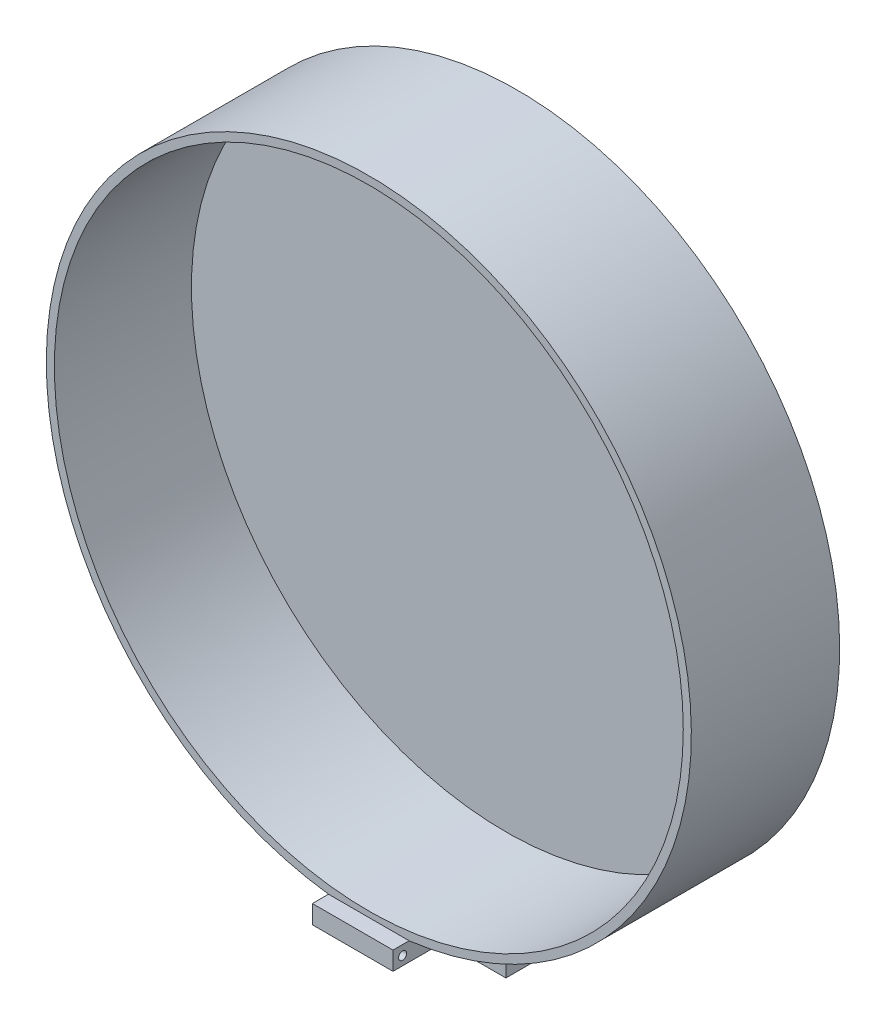
ISO-10303-21;
HEADER;
FILE_DESCRIPTION(('STEP AP214'),'2;1');
FILE_NAME('part.step','',(''),(''),'','','');
FILE_SCHEMA(('AUTOMOTIVE_DESIGN { 1 0 10303 214 1 1 1 1 }'));
ENDSEC;
DATA;
#1=APPLICATION_CONTEXT('core data for automotive mechanical design processes');
#2=APPLICATION_PROTOCOL_DEFINITION('international standard','automotive_design',2000,#1);
#3=PRODUCT_CONTEXT('',#1,'mechanical');
#4=PRODUCT('Part','Part','',(#3));
#5=PRODUCT_RELATED_PRODUCT_CATEGORY('part','',(#4));
#6=PRODUCT_DEFINITION_FORMATION('','',#4);
#7=PRODUCT_DEFINITION_CONTEXT('part definition',#1,'design');
#8=PRODUCT_DEFINITION('design','',#6,#7);
#9=PRODUCT_DEFINITION_SHAPE('','',#8);
#10=(LENGTH_UNIT() NAMED_UNIT(*) SI_UNIT(.MILLI.,.METRE.));
#11=(NAMED_UNIT(*) PLANE_ANGLE_UNIT() SI_UNIT($,.RADIAN.));
#12=(NAMED_UNIT(*) SI_UNIT($,.STERADIAN.) SOLID_ANGLE_UNIT());
#13=UNCERTAINTY_MEASURE_WITH_UNIT(LENGTH_MEASURE(1.E-05),#10,'distance_accuracy_value','');
#14=(GEOMETRIC_REPRESENTATION_CONTEXT(3) GLOBAL_UNCERTAINTY_ASSIGNED_CONTEXT((#13)) GLOBAL_UNIT_ASSIGNED_CONTEXT((#10,
#11,#12)) REPRESENTATION_CONTEXT('',''));
#15=CARTESIAN_POINT('',(0.,0.,0.));
#16=DIRECTION('',(0.,0.,1.));
#17=DIRECTION('',(1.,0.,0.));
#18=AXIS2_PLACEMENT_3D('',#15,#16,#17);
#19=CARTESIAN_POINT('',(6.35,63.1015624757804,23.368));
#20=DIRECTION('',(0.,0.,-1.));
#21=DIRECTION('',(-1.,0.,0.));
#22=AXIS2_PLACEMENT_3D('',#19,#20,#21);
#23=PLANE('',#22);
#24=CARTESIAN_POINT('',(6.35,63.1015624757804,23.368));
#25=DIRECTION('',(0.,0.,1.));
#26=DIRECTION('',(1.,0.,0.));
#27=AXIS2_PLACEMENT_3D('',#24,#25,#26);
#28=CIRCLE('',#27,49.53);
#29=CARTESIAN_POINT('',(55.88,63.1015624757804,23.368));
#30=VERTEX_POINT('',#29);
#31=EDGE_CURVE('E166',#30,#30,#28,.T.);
#32=ORIENTED_EDGE('',*,*,#31,.F.);
#33=EDGE_LOOP('',(#32));
#34=FACE_BOUND('',#33,.T.);
#35=DIRECTION('',(-1.,0.,0.));
#36=VECTOR('',#35,1.);
#37=CARTESIAN_POINT('',(12.7,12.7,23.368));
#38=LINE('',#37,#36);
#39=CARTESIAN_POINT('',(12.7,12.7,23.368));
#40=VERTEX_POINT('',#39);
#41=CARTESIAN_POINT('',(0.,12.7,23.368));
#42=VERTEX_POINT('',#41);
#43=EDGE_CURVE('E59',#40,#42,#38,.T.);
#44=ORIENTED_EDGE('',*,*,#43,.F.);
#45=CARTESIAN_POINT('',(6.35,63.1015624757804,23.368));
#46=DIRECTION('',(0.,0.,1.));
#47=DIRECTION('',(-1.,0.,0.));
#48=AXIS2_PLACEMENT_3D('',#45,#46,#47);
#49=CIRCLE('',#48,50.8);
#50=EDGE_CURVE('E175',#40,#42,#49,.T.);
#51=ORIENTED_EDGE('',*,*,#50,.T.);
#52=EDGE_LOOP('',(#44,#51));
#53=FACE_BOUND('',#52,.T.);
#54=ADVANCED_FACE('F40',(#34,#53),#23,.F.);
#55=CARTESIAN_POINT('',(6.35,63.1015624757804,23.368));
#56=DIRECTION('',(0.,0.,-1.));
#57=DIRECTION('',(-1.,0.,0.));
#58=AXIS2_PLACEMENT_3D('',#55,#56,#57);
#59=CYLINDRICAL_SURFACE('',#58,50.8);
#60=DIRECTION('',(0.,0.,-1.));
#61=VECTOR('',#60,1.);
#62=CARTESIAN_POINT('',(0.,12.7,23.368));
#63=LINE('',#62,#61);
#64=CARTESIAN_POINT('',(0.,12.7,0.));
#65=VERTEX_POINT('',#64);
#66=EDGE_CURVE('E178',#42,#65,#63,.T.);
#67=ORIENTED_EDGE('',*,*,#66,.F.);
#68=ORIENTED_EDGE('',*,*,#50,.F.);
#69=DIRECTION('',(0.,0.,-1.));
#70=VECTOR('',#69,1.);
#71=CARTESIAN_POINT('',(12.7,12.7,23.368));
#72=LINE('',#71,#70);
#73=CARTESIAN_POINT('',(12.7,12.7,0.));
#74=VERTEX_POINT('',#73);
#75=EDGE_CURVE('E138',#40,#74,#72,.T.);
#76=ORIENTED_EDGE('',*,*,#75,.T.);
#77=CARTESIAN_POINT('',(6.35,63.1015624757804,0.));
#78=DIRECTION('',(0.,0.,1.));
#79=DIRECTION('',(-1.,0.,0.));
#80=AXIS2_PLACEMENT_3D('',#77,#78,#79);
#81=CIRCLE('',#80,50.8);
#82=EDGE_CURVE('E179',#74,#65,#81,.T.);
#83=ORIENTED_EDGE('',*,*,#82,.T.);
#84=EDGE_LOOP('',(#67,#68,#76,#83));
#85=FACE_BOUND('',#84,.T.);
#86=ADVANCED_FACE('F211',(#85),#59,.T.);
#87=CARTESIAN_POINT('',(6.35000000000002,63.1015624757805,8.128));
#88=DIRECTION('',(0.,0.,1.));
#89=DIRECTION('',(1.,0.,0.));
#90=AXIS2_PLACEMENT_3D('',#87,#88,#89);
#91=PLANE('',#90);
#92=DIRECTION('',(0.,1.,0.));
#93=VECTOR('',#92,1.);
#94=CARTESIAN_POINT('',(12.7,0.,8.128));
#95=LINE('',#94,#93);
#96=CARTESIAN_POINT('',(12.7,0.,8.128));
#97=VERTEX_POINT('',#96);
#98=CARTESIAN_POINT('',(12.7,9.79462133853612,8.128));
#99=VERTEX_POINT('',#98);
#100=EDGE_CURVE('E70',#97,#99,#95,.T.);
#101=ORIENTED_EDGE('',*,*,#100,.T.);
#102=DIRECTION('',(1.,0.,0.));
#103=VECTOR('',#102,1.);
#104=CARTESIAN_POINT('',(12.7,9.79462133853612,8.128));
#105=LINE('',#104,#103);
#106=CARTESIAN_POINT('',(0.,9.79462133853612,8.128));
#107=VERTEX_POINT('',#106);
#108=EDGE_CURVE('E141',#107,#99,#105,.T.);
#109=ORIENTED_EDGE('',*,*,#108,.F.);
#110=DIRECTION('',(0.,-1.,0.));
#111=VECTOR('',#110,1.);
#112=CARTESIAN_POINT('',(0.,12.7,8.128));
#113=LINE('',#112,#111);
#114=CARTESIAN_POINT('',(0.,0.,8.128));
#115=VERTEX_POINT('',#114);
#116=EDGE_CURVE('E158',#107,#115,#113,.T.);
#117=ORIENTED_EDGE('',*,*,#116,.T.);
#118=DIRECTION('',(1.,0.,0.));
#119=VECTOR('',#118,1.);
#120=CARTESIAN_POINT('',(0.,0.,8.128));
#121=LINE('',#120,#119);
#122=EDGE_CURVE('E161',#115,#97,#121,.T.);
#123=ORIENTED_EDGE('',*,*,#122,.T.);
#124=EDGE_LOOP('',(#101,#109,#117,#123));
#125=FACE_BOUND('',#124,.T.);
#126=ADVANCED_FACE('F218',(#125),#91,.T.);
#127=CARTESIAN_POINT('',(0.,0.,23.368));
#128=DIRECTION('',(1.,0.,0.));
#129=DIRECTION('',(0.,0.,-1.));
#130=AXIS2_PLACEMENT_3D('',#127,#128,#129);
#131=PLANE('',#130);
#132=CARTESIAN_POINT('',(0.,11.1892566071958,24.3948435976436));
#133=DIRECTION('',(-1.,0.,0.));
#134=DIRECTION('',(0.,0.,1.));
#135=AXIS2_PLACEMENT_3D('',#132,#133,#134);
#136=CIRCLE('',#135,0.634999999999999);
#137=CARTESIAN_POINT('',(0.,11.1892566071958,25.0298435976436));
#138=VERTEX_POINT('',#137);
#139=EDGE_CURVE('E241',#138,#138,#136,.T.);
#140=ORIENTED_EDGE('',*,*,#139,.F.);
#141=EDGE_LOOP('',(#140));
#142=FACE_BOUND('',#141,.T.);
#143=ORIENTED_EDGE('',*,*,#116,.F.);
#144=DIRECTION('',(0.,0.,-1.));
#145=VECTOR('',#144,1.);
#146=CARTESIAN_POINT('',(0.,9.79462133853612,36.3960936888898));
#147=LINE('',#146,#145);
#148=CARTESIAN_POINT('',(0.,9.79462133853612,25.908));
#149=VERTEX_POINT('',#148);
#150=EDGE_CURVE('E154',#149,#107,#147,.T.);
#151=ORIENTED_EDGE('',*,*,#150,.F.);
#152=DIRECTION('',(0.,-1.,0.));
#153=VECTOR('',#152,1.);
#154=CARTESIAN_POINT('',(0.,12.7,25.908));
#155=LINE('',#154,#153);
#156=CARTESIAN_POINT('',(0.,12.7,25.908));
#157=VERTEX_POINT('',#156);
#158=EDGE_CURVE('E125',#157,#149,#155,.T.);
#159=ORIENTED_EDGE('',*,*,#158,.F.);
#160=DIRECTION('',(0.,0.,-1.));
#161=VECTOR('',#160,1.);
#162=CARTESIAN_POINT('',(0.,12.7,25.908));
#163=LINE('',#162,#161);
#164=EDGE_CURVE('E120',#157,#42,#163,.T.);
#165=ORIENTED_EDGE('',*,*,#164,.T.);
#166=ORIENTED_EDGE('',*,*,#66,.T.);
#167=DIRECTION('',(0.,-1.,0.));
#168=VECTOR('',#167,1.);
#169=CARTESIAN_POINT('',(0.,0.,0.));
#170=LINE('',#169,#168);
#171=CARTESIAN_POINT('',(0.,0.,0.));
#172=VERTEX_POINT('',#171);
#173=EDGE_CURVE('E171',#65,#172,#170,.T.);
#174=ORIENTED_EDGE('',*,*,#173,.T.);
#175=DIRECTION('',(0.,0.,-1.));
#176=VECTOR('',#175,1.);
#177=CARTESIAN_POINT('',(0.,0.,23.368));
#178=LINE('',#177,#176);
#179=EDGE_CURVE('E11',#115,#172,#178,.T.);
#180=ORIENTED_EDGE('',*,*,#179,.F.);
#181=EDGE_LOOP('',(#143,#151,#159,#165,#166,#174,#180));
#182=FACE_BOUND('',#181,.T.);
#183=ADVANCED_FACE('F42',(#142,#182),#131,.F.);
#184=CARTESIAN_POINT('',(0.,0.,23.368));
#185=DIRECTION('',(0.,1.,0.));
#186=DIRECTION('',(0.,0.,1.));
#187=AXIS2_PLACEMENT_3D('',#184,#185,#186);
#188=PLANE('',#187);
#189=ORIENTED_EDGE('',*,*,#122,.F.);
#190=ORIENTED_EDGE('',*,*,#179,.T.);
#191=DIRECTION('',(1.,0.,0.));
#192=VECTOR('',#191,1.);
#193=CARTESIAN_POINT('',(0.,0.,0.));
#194=LINE('',#193,#192);
#195=CARTESIAN_POINT('',(12.7,0.,0.));
#196=VERTEX_POINT('',#195);
#197=EDGE_CURVE('E183',#172,#196,#194,.T.);
#198=ORIENTED_EDGE('',*,*,#197,.T.);
#199=DIRECTION('',(0.,0.,-1.));
#200=VECTOR('',#199,1.);
#201=CARTESIAN_POINT('',(12.7,0.,23.368));
#202=LINE('',#201,#200);
#203=EDGE_CURVE('E50',#97,#196,#202,.T.);
#204=ORIENTED_EDGE('',*,*,#203,.F.);
#205=EDGE_LOOP('',(#189,#190,#198,#204));
#206=FACE_BOUND('',#205,.T.);
#207=ADVANCED_FACE('F204',(#206),#188,.F.);
#208=CARTESIAN_POINT('',(12.7,0.,23.368));
#209=DIRECTION('',(-1.,0.,0.));
#210=DIRECTION('',(0.,0.,1.));
#211=AXIS2_PLACEMENT_3D('',#208,#209,#210);
#212=PLANE('',#211);
#213=CARTESIAN_POINT('',(12.7,11.1892566071958,24.3948435976436));
#214=DIRECTION('',(-1.,0.,0.));
#215=DIRECTION('',(0.,0.,1.));
#216=AXIS2_PLACEMENT_3D('',#213,#214,#215);
#217=CIRCLE('',#216,0.634999999999999);
#218=CARTESIAN_POINT('',(12.7,11.1892566071958,25.0298435976436));
#219=VERTEX_POINT('',#218);
#220=EDGE_CURVE('E44',#219,#219,#217,.T.);
#221=ORIENTED_EDGE('',*,*,#220,.T.);
#222=EDGE_LOOP('',(#221));
#223=FACE_BOUND('',#222,.T.);
#224=ORIENTED_EDGE('',*,*,#100,.F.);
#225=ORIENTED_EDGE('',*,*,#203,.T.);
#226=DIRECTION('',(0.,1.,0.));
#227=VECTOR('',#226,1.);
#228=CARTESIAN_POINT('',(12.7,0.,0.));
#229=LINE('',#228,#227);
#230=EDGE_CURVE('E187',#196,#74,#229,.T.);
#231=ORIENTED_EDGE('',*,*,#230,.T.);
#232=ORIENTED_EDGE('',*,*,#75,.F.);
#233=DIRECTION('',(0.,0.,-1.));
#234=VECTOR('',#233,1.);
#235=CARTESIAN_POINT('',(12.7,12.7,25.908));
#236=LINE('',#235,#234);
#237=CARTESIAN_POINT('',(12.7,12.7,25.908));
#238=VERTEX_POINT('',#237);
#239=EDGE_CURVE('E118',#238,#40,#236,.T.);
#240=ORIENTED_EDGE('',*,*,#239,.F.);
#241=DIRECTION('',(0.,1.,0.));
#242=VECTOR('',#241,1.);
#243=CARTESIAN_POINT('',(12.7,9.79462133853612,25.908));
#244=LINE('',#243,#242);
#245=CARTESIAN_POINT('',(12.7,9.79462133853612,25.908));
#246=VERTEX_POINT('',#245);
#247=EDGE_CURVE('E126',#246,#238,#244,.T.);
#248=ORIENTED_EDGE('',*,*,#247,.F.);
#249=DIRECTION('',(0.,0.,-1.));
#250=VECTOR('',#249,1.);
#251=CARTESIAN_POINT('',(12.7,9.79462133853612,36.3960936888898));
#252=LINE('',#251,#250);
#253=EDGE_CURVE('E146',#246,#99,#252,.T.);
#254=ORIENTED_EDGE('',*,*,#253,.T.);
#255=EDGE_LOOP('',(#224,#225,#231,#232,#240,#248,#254));
#256=FACE_BOUND('',#255,.T.);
#257=ADVANCED_FACE('F136',(#223,#256),#212,.F.);
#258=CARTESIAN_POINT('',(6.35,63.1015624757804,0.));
#259=DIRECTION('',(0.,0.,-1.));
#260=DIRECTION('',(-1.,0.,0.));
#261=AXIS2_PLACEMENT_3D('',#258,#259,#260);
#262=PLANE('',#261);
#263=ORIENTED_EDGE('',*,*,#173,.F.);
#264=ORIENTED_EDGE('',*,*,#82,.F.);
#265=ORIENTED_EDGE('',*,*,#230,.F.);
#266=ORIENTED_EDGE('',*,*,#197,.F.);
#267=EDGE_LOOP('',(#263,#264,#265,#266));
#268=FACE_BOUND('',#267,.T.);
#269=ADVANCED_FACE('F208',(#268),#262,.T.);
#270=CARTESIAN_POINT('',(6.35,63.1015624757804,1.778));
#271=DIRECTION('',(0.,0.,1.));
#272=DIRECTION('',(1.,0.,0.));
#273=AXIS2_PLACEMENT_3D('',#270,#271,#272);
#274=CYLINDRICAL_SURFACE('',#273,49.53);
#275=CARTESIAN_POINT('',(6.35,63.1015624757804,1.778));
#276=DIRECTION('',(0.,0.,1.));
#277=DIRECTION('',(1.,0.,0.));
#278=AXIS2_PLACEMENT_3D('',#275,#276,#277);
#279=CIRCLE('',#278,49.53);
#280=CARTESIAN_POINT('',(55.88,63.1015624757804,1.778));
#281=VERTEX_POINT('',#280);
#282=EDGE_CURVE('E167',#281,#281,#279,.T.);
#283=ORIENTED_EDGE('',*,*,#282,.F.);
#284=EDGE_LOOP('',(#283));
#285=FACE_BOUND('',#284,.T.);
#286=ORIENTED_EDGE('',*,*,#31,.T.);
#287=EDGE_LOOP('',(#286));
#288=FACE_BOUND('',#287,.T.);
#289=ADVANCED_FACE('F223',(#285,#288),#274,.F.);
#290=CARTESIAN_POINT('',(6.35,63.1015624757804,1.778));
#291=DIRECTION('',(0.,0.,1.));
#292=DIRECTION('',(1.,0.,0.));
#293=AXIS2_PLACEMENT_3D('',#290,#291,#292);
#294=PLANE('',#293);
#295=ORIENTED_EDGE('',*,*,#282,.T.);
#296=EDGE_LOOP('',(#295));
#297=FACE_BOUND('',#296,.T.);
#298=ADVANCED_FACE('F267',(#297),#294,.T.);
#299=CARTESIAN_POINT('',(12.7,9.79462133853612,36.3960936888898));
#300=DIRECTION('',(0.,1.,0.));
#301=DIRECTION('',(0.,0.,1.));
#302=AXIS2_PLACEMENT_3D('',#299,#300,#301);
#303=PLANE('',#302);
#304=ORIENTED_EDGE('',*,*,#253,.F.);
#305=DIRECTION('',(1.,0.,0.));
#306=VECTOR('',#305,1.);
#307=CARTESIAN_POINT('',(0.,9.79462133853612,25.908));
#308=LINE('',#307,#306);
#309=EDGE_CURVE('E132',#149,#246,#308,.T.);
#310=ORIENTED_EDGE('',*,*,#309,.F.);
#311=ORIENTED_EDGE('',*,*,#150,.T.);
#312=ORIENTED_EDGE('',*,*,#108,.T.);
#313=EDGE_LOOP('',(#304,#310,#311,#312));
#314=FACE_BOUND('',#313,.T.);
#315=ADVANCED_FACE('F244',(#314),#303,.F.);
#316=CARTESIAN_POINT('',(12.7,12.7,25.908));
#317=DIRECTION('',(0.,-1.,0.));
#318=DIRECTION('',(1.,0.,0.));
#319=AXIS2_PLACEMENT_3D('',#316,#317,#318);
#320=PLANE('',#319);
#321=ORIENTED_EDGE('',*,*,#43,.T.);
#322=ORIENTED_EDGE('',*,*,#164,.F.);
#323=DIRECTION('',(-1.,0.,0.));
#324=VECTOR('',#323,1.);
#325=CARTESIAN_POINT('',(12.7,12.7,25.908));
#326=LINE('',#325,#324);
#327=EDGE_CURVE('E114',#238,#157,#326,.T.);
#328=ORIENTED_EDGE('',*,*,#327,.F.);
#329=ORIENTED_EDGE('',*,*,#239,.T.);
#330=EDGE_LOOP('',(#321,#322,#328,#329));
#331=FACE_BOUND('',#330,.T.);
#332=ADVANCED_FACE('F116',(#331),#320,.F.);
#333=CARTESIAN_POINT('',(0.,0.,25.908));
#334=DIRECTION('',(0.,0.,1.));
#335=DIRECTION('',(1.,0.,0.));
#336=AXIS2_PLACEMENT_3D('',#333,#334,#335);
#337=PLANE('',#336);
#338=ORIENTED_EDGE('',*,*,#247,.T.);
#339=ORIENTED_EDGE('',*,*,#327,.T.);
#340=ORIENTED_EDGE('',*,*,#158,.T.);
#341=ORIENTED_EDGE('',*,*,#309,.T.);
#342=EDGE_LOOP('',(#338,#339,#340,#341));
#343=FACE_BOUND('',#342,.T.);
#344=ADVANCED_FACE('F130',(#343),#337,.T.);
#345=CARTESIAN_POINT('',(57.15,11.1892566071958,24.3948435976436));
#346=DIRECTION('',(-1.,0.,0.));
#347=DIRECTION('',(0.,0.,1.));
#348=AXIS2_PLACEMENT_3D('',#345,#346,#347);
#349=CYLINDRICAL_SURFACE('',#348,0.634999999999999);
#350=ORIENTED_EDGE('',*,*,#139,.T.);
#351=EDGE_LOOP('',(#350));
#352=FACE_BOUND('',#351,.T.);
#353=ORIENTED_EDGE('',*,*,#220,.F.);
#354=EDGE_LOOP('',(#353));
#355=FACE_BOUND('',#354,.T.);
#356=ADVANCED_FACE('F255',(#352,#355),#349,.F.);
#357=CLOSED_SHELL('',(#54,#86,#126,#183,#207,#257,#269,#289,#298,#315,#332,#344,#356));
#358=MANIFOLD_SOLID_BREP('B2',#357);
#359=ADVANCED_BREP_SHAPE_REPRESENTATION('',(#18,#358),#14);
#360=SHAPE_DEFINITION_REPRESENTATION(#9,#359);
ENDSEC;
END-ISO-10303-21;
